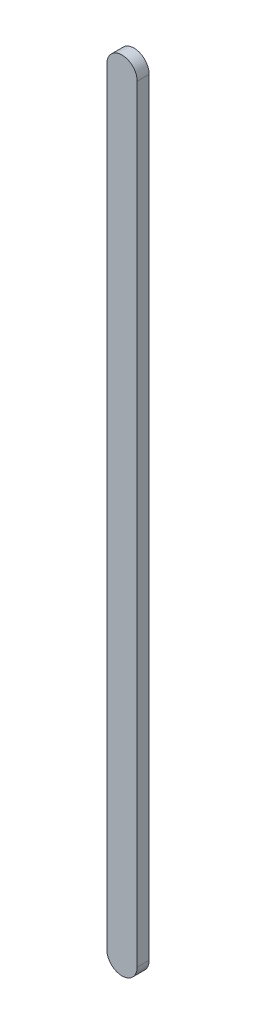
ISO-10303-21;
HEADER;
FILE_DESCRIPTION(('STEP AP214'),'2;1');
FILE_NAME('part.step','',(''),(''),'','','');
FILE_SCHEMA(('AUTOMOTIVE_DESIGN { 1 0 10303 214 1 1 1 1 }'));
ENDSEC;
DATA;
#1=APPLICATION_CONTEXT('core data for automotive mechanical design processes');
#2=APPLICATION_PROTOCOL_DEFINITION('international standard','automotive_design',2000,#1);
#3=PRODUCT_CONTEXT('',#1,'mechanical');
#4=PRODUCT('Part','Part','',(#3));
#5=PRODUCT_RELATED_PRODUCT_CATEGORY('part','',(#4));
#6=PRODUCT_DEFINITION_FORMATION('','',#4);
#7=PRODUCT_DEFINITION_CONTEXT('part definition',#1,'design');
#8=PRODUCT_DEFINITION('design','',#6,#7);
#9=PRODUCT_DEFINITION_SHAPE('','',#8);
#10=(LENGTH_UNIT() NAMED_UNIT(*) SI_UNIT(.MILLI.,.METRE.));
#11=(NAMED_UNIT(*) PLANE_ANGLE_UNIT() SI_UNIT($,.RADIAN.));
#12=(NAMED_UNIT(*) SI_UNIT($,.STERADIAN.) SOLID_ANGLE_UNIT());
#13=UNCERTAINTY_MEASURE_WITH_UNIT(LENGTH_MEASURE(1.E-05),#10,'distance_accuracy_value','');
#14=(GEOMETRIC_REPRESENTATION_CONTEXT(3) GLOBAL_UNCERTAINTY_ASSIGNED_CONTEXT((#13)) GLOBAL_UNIT_ASSIGNED_CONTEXT((#10,
#11,#12)) REPRESENTATION_CONTEXT('',''));
#15=CARTESIAN_POINT('',(0.,0.,0.));
#16=DIRECTION('',(0.,0.,1.));
#17=DIRECTION('',(1.,0.,0.));
#18=AXIS2_PLACEMENT_3D('',#15,#16,#17);
#19=CARTESIAN_POINT('',(126.76807514,101.18966046,0.));
#20=DIRECTION('',(-1.,0.,0.));
#21=DIRECTION('',(0.,1.,0.));
#22=AXIS2_PLACEMENT_3D('',#19,#20,#21);
#23=PLANE('',#22);
#24=DIRECTION('',(0.,1.,0.));
#25=VECTOR('',#24,1.);
#26=CARTESIAN_POINT('',(126.76807514,101.18966046,0.1999996));
#27=LINE('',#26,#25);
#28=CARTESIAN_POINT('',(126.76807514,101.18966046,0.1999996));
#29=VERTEX_POINT('',#28);
#30=CARTESIAN_POINT('',(126.76807514,114.02392486,0.1999996));
#31=VERTEX_POINT('',#30);
#32=EDGE_CURVE('E11',#29,#31,#27,.T.);
#33=ORIENTED_EDGE('',*,*,#32,.F.);
#34=DIRECTION('',(0.,0.,1.));
#35=VECTOR('',#34,1.);
#36=CARTESIAN_POINT('',(126.76807514,101.18966046,0.));
#37=LINE('',#36,#35);
#38=CARTESIAN_POINT('',(126.76807514,101.18966046,0.));
#39=VERTEX_POINT('',#38);
#40=EDGE_CURVE('E24',#39,#29,#37,.T.);
#41=ORIENTED_EDGE('',*,*,#40,.F.);
#42=DIRECTION('',(0.,1.,0.));
#43=VECTOR('',#42,1.);
#44=CARTESIAN_POINT('',(126.76807514,101.18966046,0.));
#45=LINE('',#44,#43);
#46=CARTESIAN_POINT('',(126.76807514,114.02392486,0.));
#47=VERTEX_POINT('',#46);
#48=EDGE_CURVE('E75',#39,#47,#45,.T.);
#49=ORIENTED_EDGE('',*,*,#48,.T.);
#50=DIRECTION('',(0.,0.,1.));
#51=VECTOR('',#50,1.);
#52=CARTESIAN_POINT('',(126.76807514,114.02392486,0.));
#53=LINE('',#52,#51);
#54=EDGE_CURVE('E37',#47,#31,#53,.T.);
#55=ORIENTED_EDGE('',*,*,#54,.T.);
#56=EDGE_LOOP('',(#33,#41,#49,#55));
#57=FACE_BOUND('',#56,.T.);
#58=ADVANCED_FACE('F17',(#57),#23,.F.);
#59=CARTESIAN_POINT('',(126.51407514,114.02392486,0.));
#60=DIRECTION('',(0.,0.,-1.));
#61=DIRECTION('',(1.,0.,0.));
#62=AXIS2_PLACEMENT_3D('',#59,#60,#61);
#63=CYLINDRICAL_SURFACE('',#62,0.254);
#64=CARTESIAN_POINT('',(126.51407514,114.02392486,0.1999996));
#65=DIRECTION('',(0.,0.,1.));
#66=DIRECTION('',(1.,0.,0.));
#67=AXIS2_PLACEMENT_3D('',#64,#65,#66);
#68=CIRCLE('',#67,0.254);
#69=CARTESIAN_POINT('',(126.26007514,114.02392486,0.1999996));
#70=VERTEX_POINT('',#69);
#71=EDGE_CURVE('E83',#31,#70,#68,.T.);
#72=ORIENTED_EDGE('',*,*,#71,.F.);
#73=ORIENTED_EDGE('',*,*,#54,.F.);
#74=CARTESIAN_POINT('',(126.51407514,114.02392486,0.));
#75=DIRECTION('',(0.,0.,1.));
#76=DIRECTION('',(1.,0.,0.));
#77=AXIS2_PLACEMENT_3D('',#74,#75,#76);
#78=CIRCLE('',#77,0.254);
#79=CARTESIAN_POINT('',(126.26007514,114.02392486,0.));
#80=VERTEX_POINT('',#79);
#81=EDGE_CURVE('E81',#47,#80,#78,.T.);
#82=ORIENTED_EDGE('',*,*,#81,.T.);
#83=DIRECTION('',(0.,0.,1.));
#84=VECTOR('',#83,1.);
#85=CARTESIAN_POINT('',(126.26007514,114.02392486,0.));
#86=LINE('',#85,#84);
#87=EDGE_CURVE('E67',#80,#70,#86,.T.);
#88=ORIENTED_EDGE('',*,*,#87,.T.);
#89=EDGE_LOOP('',(#72,#73,#82,#88));
#90=FACE_BOUND('',#89,.T.);
#91=ADVANCED_FACE('F89',(#90),#63,.T.);
#92=CARTESIAN_POINT('',(126.26007514,114.02392486,0.));
#93=DIRECTION('',(1.,0.,0.));
#94=DIRECTION('',(0.,-1.,0.));
#95=AXIS2_PLACEMENT_3D('',#92,#93,#94);
#96=PLANE('',#95);
#97=DIRECTION('',(0.,-1.,0.));
#98=VECTOR('',#97,1.);
#99=CARTESIAN_POINT('',(126.26007514,114.02392486,0.1999996));
#100=LINE('',#99,#98);
#101=CARTESIAN_POINT('',(126.26007514,101.18966046,0.1999996));
#102=VERTEX_POINT('',#101);
#103=EDGE_CURVE('E71',#70,#102,#100,.T.);
#104=ORIENTED_EDGE('',*,*,#103,.F.);
#105=ORIENTED_EDGE('',*,*,#87,.F.);
#106=DIRECTION('',(0.,-1.,0.));
#107=VECTOR('',#106,1.);
#108=CARTESIAN_POINT('',(126.26007514,114.02392486,0.));
#109=LINE('',#108,#107);
#110=CARTESIAN_POINT('',(126.26007514,101.18966046,0.));
#111=VERTEX_POINT('',#110);
#112=EDGE_CURVE('E63',#80,#111,#109,.T.);
#113=ORIENTED_EDGE('',*,*,#112,.T.);
#114=DIRECTION('',(0.,0.,1.));
#115=VECTOR('',#114,1.);
#116=CARTESIAN_POINT('',(126.26007514,101.18966046,0.));
#117=LINE('',#116,#115);
#118=EDGE_CURVE('E53',#111,#102,#117,.T.);
#119=ORIENTED_EDGE('',*,*,#118,.T.);
#120=EDGE_LOOP('',(#104,#105,#113,#119));
#121=FACE_BOUND('',#120,.T.);
#122=ADVANCED_FACE('F66',(#121),#96,.F.);
#123=CARTESIAN_POINT('',(126.51407514,101.18966046,0.));
#124=DIRECTION('',(0.,0.,-1.));
#125=DIRECTION('',(-1.,0.,0.));
#126=AXIS2_PLACEMENT_3D('',#123,#124,#125);
#127=CYLINDRICAL_SURFACE('',#126,0.253999999999995);
#128=CARTESIAN_POINT('',(126.51407514,101.18966046,0.1999996));
#129=DIRECTION('',(0.,0.,1.));
#130=DIRECTION('',(-1.,0.,0.));
#131=AXIS2_PLACEMENT_3D('',#128,#129,#130);
#132=CIRCLE('',#131,0.253999999999995);
#133=EDGE_CURVE('E59',#102,#29,#132,.T.);
#134=ORIENTED_EDGE('',*,*,#133,.F.);
#135=ORIENTED_EDGE('',*,*,#118,.F.);
#136=CARTESIAN_POINT('',(126.51407514,101.18966046,0.));
#137=DIRECTION('',(0.,0.,1.));
#138=DIRECTION('',(-1.,0.,0.));
#139=AXIS2_PLACEMENT_3D('',#136,#137,#138);
#140=CIRCLE('',#139,0.253999999999995);
#141=EDGE_CURVE('E57',#111,#39,#140,.T.);
#142=ORIENTED_EDGE('',*,*,#141,.T.);
#143=ORIENTED_EDGE('',*,*,#40,.T.);
#144=EDGE_LOOP('',(#134,#135,#142,#143));
#145=FACE_BOUND('',#144,.T.);
#146=ADVANCED_FACE('F55',(#145),#127,.T.);
#147=CARTESIAN_POINT('',(126.76807514,101.18966046,0.));
#148=DIRECTION('',(0.,0.,-1.));
#149=DIRECTION('',(-1.,0.,0.));
#150=AXIS2_PLACEMENT_3D('',#147,#148,#149);
#151=PLANE('',#150);
#152=ORIENTED_EDGE('',*,*,#141,.F.);
#153=ORIENTED_EDGE('',*,*,#112,.F.);
#154=ORIENTED_EDGE('',*,*,#81,.F.);
#155=ORIENTED_EDGE('',*,*,#48,.F.);
#156=EDGE_LOOP('',(#152,#153,#154,#155));
#157=FACE_BOUND('',#156,.T.);
#158=ADVANCED_FACE('F74',(#157),#151,.T.);
#159=CARTESIAN_POINT('',(126.76807514,101.18966046,0.1999996));
#160=DIRECTION('',(0.,0.,-1.));
#161=DIRECTION('',(-1.,0.,0.));
#162=AXIS2_PLACEMENT_3D('',#159,#160,#161);
#163=PLANE('',#162);
#164=ORIENTED_EDGE('',*,*,#32,.T.);
#165=ORIENTED_EDGE('',*,*,#71,.T.);
#166=ORIENTED_EDGE('',*,*,#103,.T.);
#167=ORIENTED_EDGE('',*,*,#133,.T.);
#168=EDGE_LOOP('',(#164,#165,#166,#167));
#169=FACE_BOUND('',#168,.T.);
#170=ADVANCED_FACE('F91',(#169),#163,.F.);
#171=CLOSED_SHELL('',(#58,#91,#122,#146,#158,#170));
#172=MANIFOLD_SOLID_BREP('B1',#171);
#173=ADVANCED_BREP_SHAPE_REPRESENTATION('',(#18,#172),#14);
#174=SHAPE_DEFINITION_REPRESENTATION(#9,#173);
ENDSEC;
END-ISO-10303-21;
